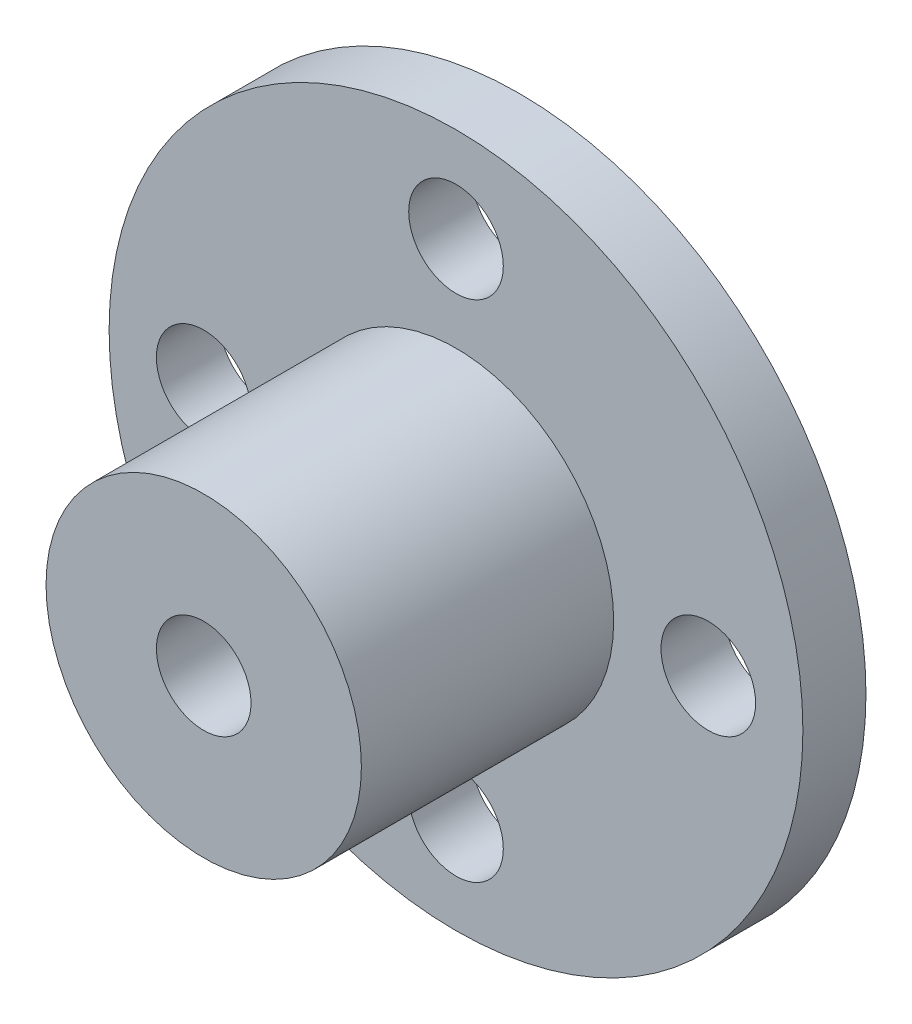
ISO-10303-21;
HEADER;
FILE_DESCRIPTION(('STEP AP214'),'2;1');
FILE_NAME('part.step','',(''),(''),'','','');
FILE_SCHEMA(('AUTOMOTIVE_DESIGN { 1 0 10303 214 1 1 1 1 }'));
ENDSEC;
DATA;
#1=APPLICATION_CONTEXT('core data for automotive mechanical design processes');
#2=APPLICATION_PROTOCOL_DEFINITION('international standard','automotive_design',2000,#1);
#3=PRODUCT_CONTEXT('',#1,'mechanical');
#4=PRODUCT('Part','Part','',(#3));
#5=PRODUCT_RELATED_PRODUCT_CATEGORY('part','',(#4));
#6=PRODUCT_DEFINITION_FORMATION('','',#4);
#7=PRODUCT_DEFINITION_CONTEXT('part definition',#1,'design');
#8=PRODUCT_DEFINITION('design','',#6,#7);
#9=PRODUCT_DEFINITION_SHAPE('','',#8);
#10=(LENGTH_UNIT() NAMED_UNIT(*) SI_UNIT(.MILLI.,.METRE.));
#11=(NAMED_UNIT(*) PLANE_ANGLE_UNIT() SI_UNIT($,.RADIAN.));
#12=(NAMED_UNIT(*) SI_UNIT($,.STERADIAN.) SOLID_ANGLE_UNIT());
#13=UNCERTAINTY_MEASURE_WITH_UNIT(LENGTH_MEASURE(1.E-05),#10,'distance_accuracy_value','');
#14=(GEOMETRIC_REPRESENTATION_CONTEXT(3) GLOBAL_UNCERTAINTY_ASSIGNED_CONTEXT((#13)) GLOBAL_UNIT_ASSIGNED_CONTEXT((#10,
#11,#12)) REPRESENTATION_CONTEXT('',''));
#15=CARTESIAN_POINT('',(0.,0.,0.));
#16=DIRECTION('',(0.,0.,1.));
#17=DIRECTION('',(1.,0.,0.));
#18=AXIS2_PLACEMENT_3D('',#15,#16,#17);
#19=CARTESIAN_POINT('',(0.,0.,2.));
#20=DIRECTION('',(0.,0.,-1.));
#21=DIRECTION('',(-1.,0.,0.));
#22=AXIS2_PLACEMENT_3D('',#19,#20,#21);
#23=CYLINDRICAL_SURFACE('',#22,11.);
#24=CARTESIAN_POINT('',(0.,0.,2.));
#25=DIRECTION('',(0.,0.,1.));
#26=DIRECTION('',(1.,0.,0.));
#27=AXIS2_PLACEMENT_3D('',#24,#25,#26);
#28=CIRCLE('',#27,11.);
#29=CARTESIAN_POINT('',(11.,0.,2.));
#30=VERTEX_POINT('',#29);
#31=EDGE_CURVE('E40',#30,#30,#28,.T.);
#32=ORIENTED_EDGE('',*,*,#31,.F.);
#33=EDGE_LOOP('',(#32));
#34=FACE_BOUND('',#33,.T.);
#35=CARTESIAN_POINT('',(0.,0.,0.));
#36=DIRECTION('',(0.,0.,1.));
#37=DIRECTION('',(1.,0.,0.));
#38=AXIS2_PLACEMENT_3D('',#35,#36,#37);
#39=CIRCLE('',#38,11.);
#40=CARTESIAN_POINT('',(11.,0.,0.));
#41=VERTEX_POINT('',#40);
#42=EDGE_CURVE('E36',#41,#41,#39,.T.);
#43=ORIENTED_EDGE('',*,*,#42,.T.);
#44=EDGE_LOOP('',(#43));
#45=FACE_BOUND('',#44,.T.);
#46=ADVANCED_FACE('F33',(#34,#45),#23,.T.);
#47=CARTESIAN_POINT('',(0.,0.,2.));
#48=DIRECTION('',(0.,0.,1.));
#49=DIRECTION('',(1.,0.,0.));
#50=AXIS2_PLACEMENT_3D('',#47,#48,#49);
#51=PLANE('',#50);
#52=CARTESIAN_POINT('',(-8.,0.,2.));
#53=DIRECTION('',(0.,0.,1.));
#54=DIRECTION('',(1.,0.,0.));
#55=AXIS2_PLACEMENT_3D('',#52,#53,#54);
#56=CIRCLE('',#55,1.5);
#57=CARTESIAN_POINT('',(-6.5,0.,2.));
#58=VERTEX_POINT('',#57);
#59=EDGE_CURVE('E53',#58,#58,#56,.T.);
#60=ORIENTED_EDGE('',*,*,#59,.F.);
#61=EDGE_LOOP('',(#60));
#62=FACE_BOUND('',#61,.T.);
#63=CARTESIAN_POINT('',(0.,-8.,2.));
#64=DIRECTION('',(0.,0.,1.));
#65=DIRECTION('',(1.,0.,0.));
#66=AXIS2_PLACEMENT_3D('',#63,#64,#65);
#67=CIRCLE('',#66,1.5);
#68=CARTESIAN_POINT('',(1.50000000000003,-8.,2.));
#69=VERTEX_POINT('',#68);
#70=EDGE_CURVE('E58',#69,#69,#67,.T.);
#71=ORIENTED_EDGE('',*,*,#70,.F.);
#72=EDGE_LOOP('',(#71));
#73=FACE_BOUND('',#72,.T.);
#74=CARTESIAN_POINT('',(8.,0.,2.));
#75=DIRECTION('',(0.,0.,1.));
#76=DIRECTION('',(1.,0.,0.));
#77=AXIS2_PLACEMENT_3D('',#74,#75,#76);
#78=CIRCLE('',#77,1.5);
#79=CARTESIAN_POINT('',(9.5,0.,2.));
#80=VERTEX_POINT('',#79);
#81=EDGE_CURVE('E61',#80,#80,#78,.T.);
#82=ORIENTED_EDGE('',*,*,#81,.F.);
#83=EDGE_LOOP('',(#82));
#84=FACE_BOUND('',#83,.T.);
#85=CARTESIAN_POINT('',(0.,8.,2.));
#86=DIRECTION('',(0.,0.,1.));
#87=DIRECTION('',(1.,0.,0.));
#88=AXIS2_PLACEMENT_3D('',#85,#86,#87);
#89=CIRCLE('',#88,1.5);
#90=CARTESIAN_POINT('',(1.49999999999992,8.,2.));
#91=VERTEX_POINT('',#90);
#92=EDGE_CURVE('E64',#91,#91,#89,.T.);
#93=ORIENTED_EDGE('',*,*,#92,.F.);
#94=EDGE_LOOP('',(#93));
#95=FACE_BOUND('',#94,.T.);
#96=CARTESIAN_POINT('',(0.,0.,2.));
#97=DIRECTION('',(0.,0.,1.));
#98=DIRECTION('',(1.,0.,0.));
#99=AXIS2_PLACEMENT_3D('',#96,#97,#98);
#100=CIRCLE('',#99,5.);
#101=CARTESIAN_POINT('',(5.,0.,2.));
#102=VERTEX_POINT('',#101);
#103=EDGE_CURVE('E10',#102,#102,#100,.T.);
#104=ORIENTED_EDGE('',*,*,#103,.F.);
#105=EDGE_LOOP('',(#104));
#106=FACE_BOUND('',#105,.T.);
#107=ORIENTED_EDGE('',*,*,#31,.T.);
#108=EDGE_LOOP('',(#107));
#109=FACE_BOUND('',#108,.T.);
#110=ADVANCED_FACE('F86',(#62,#73,#84,#95,#106,#109),#51,.T.);
#111=CARTESIAN_POINT('',(0.,0.,0.));
#112=DIRECTION('',(0.,0.,1.));
#113=DIRECTION('',(1.,0.,0.));
#114=AXIS2_PLACEMENT_3D('',#111,#112,#113);
#115=PLANE('',#114);
#116=CARTESIAN_POINT('',(-8.,0.,0.));
#117=DIRECTION('',(0.,0.,-1.));
#118=DIRECTION('',(-1.,0.,0.));
#119=AXIS2_PLACEMENT_3D('',#116,#117,#118);
#120=CIRCLE('',#119,1.5);
#121=CARTESIAN_POINT('',(-9.5,0.,0.));
#122=VERTEX_POINT('',#121);
#123=EDGE_CURVE('E67',#122,#122,#120,.T.);
#124=ORIENTED_EDGE('',*,*,#123,.F.);
#125=EDGE_LOOP('',(#124));
#126=FACE_BOUND('',#125,.T.);
#127=CARTESIAN_POINT('',(0.,-8.,0.));
#128=DIRECTION('',(0.,0.,-1.));
#129=DIRECTION('',(-1.,0.,0.));
#130=AXIS2_PLACEMENT_3D('',#127,#128,#129);
#131=CIRCLE('',#130,1.5);
#132=CARTESIAN_POINT('',(-1.49999999999997,-8.,0.));
#133=VERTEX_POINT('',#132);
#134=EDGE_CURVE('E74',#133,#133,#131,.T.);
#135=ORIENTED_EDGE('',*,*,#134,.F.);
#136=EDGE_LOOP('',(#135));
#137=FACE_BOUND('',#136,.T.);
#138=CARTESIAN_POINT('',(8.,0.,0.));
#139=DIRECTION('',(0.,0.,-1.));
#140=DIRECTION('',(-1.,0.,0.));
#141=AXIS2_PLACEMENT_3D('',#138,#139,#140);
#142=CIRCLE('',#141,1.5);
#143=CARTESIAN_POINT('',(6.5,0.,0.));
#144=VERTEX_POINT('',#143);
#145=EDGE_CURVE('E71',#144,#144,#142,.T.);
#146=ORIENTED_EDGE('',*,*,#145,.F.);
#147=EDGE_LOOP('',(#146));
#148=FACE_BOUND('',#147,.T.);
#149=CARTESIAN_POINT('',(0.,8.,0.));
#150=DIRECTION('',(0.,0.,-1.));
#151=DIRECTION('',(-1.,0.,0.));
#152=AXIS2_PLACEMENT_3D('',#149,#150,#151);
#153=CIRCLE('',#152,1.5);
#154=CARTESIAN_POINT('',(-1.50000000000008,8.,0.));
#155=VERTEX_POINT('',#154);
#156=EDGE_CURVE('E68',#155,#155,#153,.T.);
#157=ORIENTED_EDGE('',*,*,#156,.F.);
#158=EDGE_LOOP('',(#157));
#159=FACE_BOUND('',#158,.T.);
#160=CARTESIAN_POINT('',(0.,0.,0.));
#161=DIRECTION('',(0.,0.,1.));
#162=DIRECTION('',(1.,0.,0.));
#163=AXIS2_PLACEMENT_3D('',#160,#161,#162);
#164=CIRCLE('',#163,1.5);
#165=CARTESIAN_POINT('',(1.5,0.,0.));
#166=VERTEX_POINT('',#165);
#167=EDGE_CURVE('E50',#166,#166,#164,.T.);
#168=ORIENTED_EDGE('',*,*,#167,.T.);
#169=EDGE_LOOP('',(#168));
#170=FACE_BOUND('',#169,.T.);
#171=ORIENTED_EDGE('',*,*,#42,.F.);
#172=EDGE_LOOP('',(#171));
#173=FACE_BOUND('',#172,.T.);
#174=ADVANCED_FACE('F82',(#126,#137,#148,#159,#170,#173),#115,.F.);
#175=CARTESIAN_POINT('',(0.,0.,10.));
#176=DIRECTION('',(0.,0.,-1.));
#177=DIRECTION('',(-1.,0.,0.));
#178=AXIS2_PLACEMENT_3D('',#175,#176,#177);
#179=CYLINDRICAL_SURFACE('',#178,5.);
#180=CARTESIAN_POINT('',(0.,0.,10.));
#181=DIRECTION('',(0.,0.,1.));
#182=DIRECTION('',(1.,0.,0.));
#183=AXIS2_PLACEMENT_3D('',#180,#181,#182);
#184=CIRCLE('',#183,5.);
#185=CARTESIAN_POINT('',(5.,0.,10.));
#186=VERTEX_POINT('',#185);
#187=EDGE_CURVE('E46',#186,#186,#184,.T.);
#188=ORIENTED_EDGE('',*,*,#187,.F.);
#189=EDGE_LOOP('',(#188));
#190=FACE_BOUND('',#189,.T.);
#191=ORIENTED_EDGE('',*,*,#103,.T.);
#192=EDGE_LOOP('',(#191));
#193=FACE_BOUND('',#192,.T.);
#194=ADVANCED_FACE('F85',(#190,#193),#179,.T.);
#195=CARTESIAN_POINT('',(0.,0.,10.));
#196=DIRECTION('',(0.,0.,1.));
#197=DIRECTION('',(1.,0.,0.));
#198=AXIS2_PLACEMENT_3D('',#195,#196,#197);
#199=PLANE('',#198);
#200=CARTESIAN_POINT('',(0.,0.,10.));
#201=DIRECTION('',(0.,0.,1.));
#202=DIRECTION('',(1.,0.,0.));
#203=AXIS2_PLACEMENT_3D('',#200,#201,#202);
#204=CIRCLE('',#203,1.5);
#205=CARTESIAN_POINT('',(1.5,0.,10.));
#206=VERTEX_POINT('',#205);
#207=EDGE_CURVE('E49',#206,#206,#204,.T.);
#208=ORIENTED_EDGE('',*,*,#207,.F.);
#209=EDGE_LOOP('',(#208));
#210=FACE_BOUND('',#209,.T.);
#211=ORIENTED_EDGE('',*,*,#187,.T.);
#212=EDGE_LOOP('',(#211));
#213=FACE_BOUND('',#212,.T.);
#214=ADVANCED_FACE('F114',(#210,#213),#199,.T.);
#215=CARTESIAN_POINT('',(0.,0.,10.));
#216=DIRECTION('',(0.,0.,-1.));
#217=DIRECTION('',(-1.,0.,0.));
#218=AXIS2_PLACEMENT_3D('',#215,#216,#217);
#219=CYLINDRICAL_SURFACE('',#218,1.5);
#220=ORIENTED_EDGE('',*,*,#207,.T.);
#221=EDGE_LOOP('',(#220));
#222=FACE_BOUND('',#221,.T.);
#223=ORIENTED_EDGE('',*,*,#167,.F.);
#224=EDGE_LOOP('',(#223));
#225=FACE_BOUND('',#224,.T.);
#226=ADVANCED_FACE('F118',(#222,#225),#219,.F.);
#227=CARTESIAN_POINT('',(0.,8.,8.));
#228=DIRECTION('',(0.,0.,-1.));
#229=DIRECTION('',(-1.,0.,0.));
#230=AXIS2_PLACEMENT_3D('',#227,#228,#229);
#231=CYLINDRICAL_SURFACE('',#230,1.5);
#232=ORIENTED_EDGE('',*,*,#92,.T.);
#233=EDGE_LOOP('',(#232));
#234=FACE_BOUND('',#233,.T.);
#235=ORIENTED_EDGE('',*,*,#156,.T.);
#236=EDGE_LOOP('',(#235));
#237=FACE_BOUND('',#236,.T.);
#238=ADVANCED_FACE('F122',(#234,#237),#231,.F.);
#239=CARTESIAN_POINT('',(8.,0.,8.));
#240=DIRECTION('',(0.,0.,-1.));
#241=DIRECTION('',(-1.,0.,0.));
#242=AXIS2_PLACEMENT_3D('',#239,#240,#241);
#243=CYLINDRICAL_SURFACE('',#242,1.5);
#244=ORIENTED_EDGE('',*,*,#81,.T.);
#245=EDGE_LOOP('',(#244));
#246=FACE_BOUND('',#245,.T.);
#247=ORIENTED_EDGE('',*,*,#145,.T.);
#248=EDGE_LOOP('',(#247));
#249=FACE_BOUND('',#248,.T.);
#250=ADVANCED_FACE('F126',(#246,#249),#243,.F.);
#251=CARTESIAN_POINT('',(0.,-8.,8.));
#252=DIRECTION('',(0.,0.,-1.));
#253=DIRECTION('',(-1.,0.,0.));
#254=AXIS2_PLACEMENT_3D('',#251,#252,#253);
#255=CYLINDRICAL_SURFACE('',#254,1.5);
#256=ORIENTED_EDGE('',*,*,#70,.T.);
#257=EDGE_LOOP('',(#256));
#258=FACE_BOUND('',#257,.T.);
#259=ORIENTED_EDGE('',*,*,#134,.T.);
#260=EDGE_LOOP('',(#259));
#261=FACE_BOUND('',#260,.T.);
#262=ADVANCED_FACE('F130',(#258,#261),#255,.F.);
#263=CARTESIAN_POINT('',(-8.,0.,8.));
#264=DIRECTION('',(0.,0.,-1.));
#265=DIRECTION('',(-1.,0.,0.));
#266=AXIS2_PLACEMENT_3D('',#263,#264,#265);
#267=CYLINDRICAL_SURFACE('',#266,1.5);
#268=ORIENTED_EDGE('',*,*,#59,.T.);
#269=EDGE_LOOP('',(#268));
#270=FACE_BOUND('',#269,.T.);
#271=ORIENTED_EDGE('',*,*,#123,.T.);
#272=EDGE_LOOP('',(#271));
#273=FACE_BOUND('',#272,.T.);
#274=ADVANCED_FACE('F80',(#270,#273),#267,.F.);
#275=CLOSED_SHELL('',(#46,#110,#174,#194,#214,#226,#238,#250,#262,#274));
#276=MANIFOLD_SOLID_BREP('B2',#275);
#277=ADVANCED_BREP_SHAPE_REPRESENTATION('',(#18,#276),#14);
#278=SHAPE_DEFINITION_REPRESENTATION(#9,#277);
ENDSEC;
END-ISO-10303-21;
